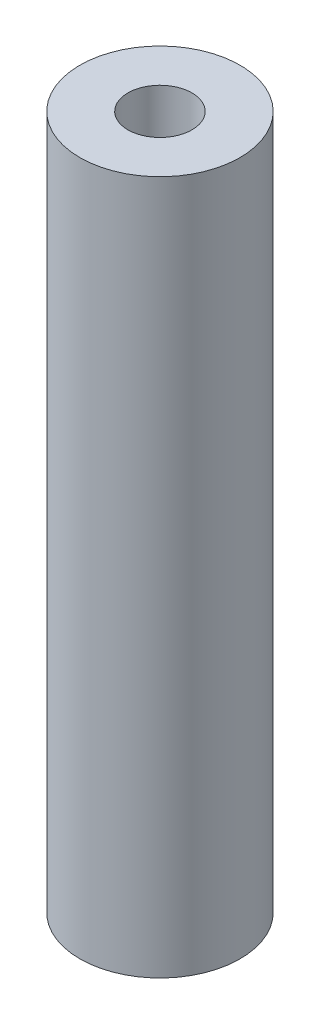
ISO-10303-21;
HEADER;
FILE_DESCRIPTION(('STEP AP214'),'2;1');
FILE_NAME('part.step','',(''),(''),'','','');
FILE_SCHEMA(('AUTOMOTIVE_DESIGN { 1 0 10303 214 1 1 1 1 }'));
ENDSEC;
DATA;
#1=APPLICATION_CONTEXT('core data for automotive mechanical design processes');
#2=APPLICATION_PROTOCOL_DEFINITION('international standard','automotive_design',2000,#1);
#3=PRODUCT_CONTEXT('',#1,'mechanical');
#4=PRODUCT('Part','Part','',(#3));
#5=PRODUCT_RELATED_PRODUCT_CATEGORY('part','',(#4));
#6=PRODUCT_DEFINITION_FORMATION('','',#4);
#7=PRODUCT_DEFINITION_CONTEXT('part definition',#1,'design');
#8=PRODUCT_DEFINITION('design','',#6,#7);
#9=PRODUCT_DEFINITION_SHAPE('','',#8);
#10=(LENGTH_UNIT() NAMED_UNIT(*) SI_UNIT(.MILLI.,.METRE.));
#11=(NAMED_UNIT(*) PLANE_ANGLE_UNIT() SI_UNIT($,.RADIAN.));
#12=(NAMED_UNIT(*) SI_UNIT($,.STERADIAN.) SOLID_ANGLE_UNIT());
#13=UNCERTAINTY_MEASURE_WITH_UNIT(LENGTH_MEASURE(1.E-05),#10,'distance_accuracy_value','');
#14=(GEOMETRIC_REPRESENTATION_CONTEXT(3) GLOBAL_UNCERTAINTY_ASSIGNED_CONTEXT((#13)) GLOBAL_UNIT_ASSIGNED_CONTEXT((#10,
#11,#12)) REPRESENTATION_CONTEXT('',''));
#15=CARTESIAN_POINT('',(0.,0.,0.));
#16=DIRECTION('',(0.,0.,1.));
#17=DIRECTION('',(1.,0.,0.));
#18=AXIS2_PLACEMENT_3D('',#15,#16,#17);
#19=CARTESIAN_POINT('',(0.,65.,0.));
#20=DIRECTION('',(0.,1.,0.));
#21=DIRECTION('',(0.,0.,1.));
#22=AXIS2_PLACEMENT_3D('',#19,#20,#21);
#23=PLANE('',#22);
#24=CARTESIAN_POINT('',(0.,65.,0.));
#25=DIRECTION('',(0.,1.,0.));
#26=DIRECTION('',(0.,0.,1.));
#27=AXIS2_PLACEMENT_3D('',#24,#25,#26);
#28=CIRCLE('',#27,7.5);
#29=CARTESIAN_POINT('',(0.,65.,7.5));
#30=VERTEX_POINT('',#29);
#31=EDGE_CURVE('E10',#30,#30,#28,.T.);
#32=ORIENTED_EDGE('',*,*,#31,.T.);
#33=EDGE_LOOP('',(#32));
#34=FACE_BOUND('',#33,.T.);
#35=CARTESIAN_POINT('',(0.,65.,0.));
#36=DIRECTION('',(0.,1.,0.));
#37=DIRECTION('',(0.,0.,1.));
#38=AXIS2_PLACEMENT_3D('',#35,#36,#37);
#39=CIRCLE('',#38,3.);
#40=CARTESIAN_POINT('',(0.,65.,3.));
#41=VERTEX_POINT('',#40);
#42=EDGE_CURVE('E47',#41,#41,#39,.T.);
#43=ORIENTED_EDGE('',*,*,#42,.F.);
#44=EDGE_LOOP('',(#43));
#45=FACE_BOUND('',#44,.T.);
#46=ADVANCED_FACE('F36',(#34,#45),#23,.T.);
#47=CARTESIAN_POINT('',(0.,0.,0.));
#48=DIRECTION('',(0.,1.,0.));
#49=DIRECTION('',(0.,0.,1.));
#50=AXIS2_PLACEMENT_3D('',#47,#48,#49);
#51=PLANE('',#50);
#52=CARTESIAN_POINT('',(0.,0.,0.));
#53=DIRECTION('',(0.,1.,0.));
#54=DIRECTION('',(0.,0.,1.));
#55=AXIS2_PLACEMENT_3D('',#52,#53,#54);
#56=CIRCLE('',#55,7.5);
#57=CARTESIAN_POINT('',(0.,0.,7.5));
#58=VERTEX_POINT('',#57);
#59=EDGE_CURVE('E40',#58,#58,#56,.T.);
#60=ORIENTED_EDGE('',*,*,#59,.F.);
#61=EDGE_LOOP('',(#60));
#62=FACE_BOUND('',#61,.T.);
#63=CARTESIAN_POINT('',(0.,0.,0.));
#64=DIRECTION('',(0.,1.,0.));
#65=DIRECTION('',(0.,0.,1.));
#66=AXIS2_PLACEMENT_3D('',#63,#64,#65);
#67=CIRCLE('',#66,3.);
#68=CARTESIAN_POINT('',(0.,0.,3.));
#69=VERTEX_POINT('',#68);
#70=EDGE_CURVE('E49',#69,#69,#67,.T.);
#71=ORIENTED_EDGE('',*,*,#70,.T.);
#72=EDGE_LOOP('',(#71));
#73=FACE_BOUND('',#72,.T.);
#74=ADVANCED_FACE('F59',(#62,#73),#51,.F.);
#75=CARTESIAN_POINT('',(0.,65.,0.));
#76=DIRECTION('',(0.,-1.,0.));
#77=DIRECTION('',(0.,0.,-1.));
#78=AXIS2_PLACEMENT_3D('',#75,#76,#77);
#79=CYLINDRICAL_SURFACE('',#78,7.5);
#80=ORIENTED_EDGE('',*,*,#31,.F.);
#81=EDGE_LOOP('',(#80));
#82=FACE_BOUND('',#81,.T.);
#83=ORIENTED_EDGE('',*,*,#59,.T.);
#84=EDGE_LOOP('',(#83));
#85=FACE_BOUND('',#84,.T.);
#86=ADVANCED_FACE('F38',(#82,#85),#79,.T.);
#87=CARTESIAN_POINT('',(0.,65.,0.));
#88=DIRECTION('',(0.,-1.,0.));
#89=DIRECTION('',(0.,0.,-1.));
#90=AXIS2_PLACEMENT_3D('',#87,#88,#89);
#91=CYLINDRICAL_SURFACE('',#90,3.);
#92=ORIENTED_EDGE('',*,*,#42,.T.);
#93=EDGE_LOOP('',(#92));
#94=FACE_BOUND('',#93,.T.);
#95=ORIENTED_EDGE('',*,*,#70,.F.);
#96=EDGE_LOOP('',(#95));
#97=FACE_BOUND('',#96,.T.);
#98=ADVANCED_FACE('F55',(#94,#97),#91,.F.);
#99=CLOSED_SHELL('',(#46,#74,#86,#98));
#100=MANIFOLD_SOLID_BREP('B2',#99);
#101=ADVANCED_BREP_SHAPE_REPRESENTATION('',(#18,#100),#14);
#102=SHAPE_DEFINITION_REPRESENTATION(#9,#101);
ENDSEC;
END-ISO-10303-21;
